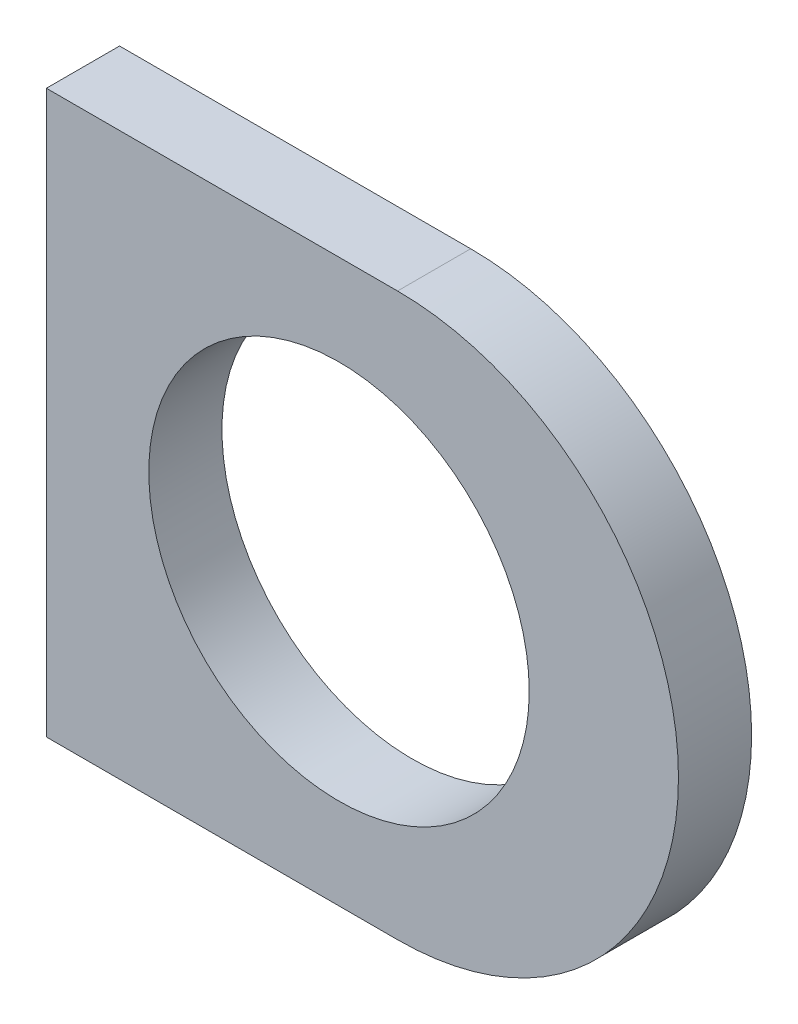
ISO-10303-21;
HEADER;
FILE_DESCRIPTION(('STEP AP214'),'2;1');
FILE_NAME('part.step','',(''),(''),'','','');
FILE_SCHEMA(('AUTOMOTIVE_DESIGN { 1 0 10303 214 1 1 1 1 }'));
ENDSEC;
DATA;
#1=APPLICATION_CONTEXT('core data for automotive mechanical design processes');
#2=APPLICATION_PROTOCOL_DEFINITION('international standard','automotive_design',2000,#1);
#3=PRODUCT_CONTEXT('',#1,'mechanical');
#4=PRODUCT('Part','Part','',(#3));
#5=PRODUCT_RELATED_PRODUCT_CATEGORY('part','',(#4));
#6=PRODUCT_DEFINITION_FORMATION('','',#4);
#7=PRODUCT_DEFINITION_CONTEXT('part definition',#1,'design');
#8=PRODUCT_DEFINITION('design','',#6,#7);
#9=PRODUCT_DEFINITION_SHAPE('','',#8);
#10=(LENGTH_UNIT() NAMED_UNIT(*) SI_UNIT(.MILLI.,.METRE.));
#11=(NAMED_UNIT(*) PLANE_ANGLE_UNIT() SI_UNIT($,.RADIAN.));
#12=(NAMED_UNIT(*) SI_UNIT($,.STERADIAN.) SOLID_ANGLE_UNIT());
#13=UNCERTAINTY_MEASURE_WITH_UNIT(LENGTH_MEASURE(1.E-05),#10,'distance_accuracy_value','');
#14=(GEOMETRIC_REPRESENTATION_CONTEXT(3) GLOBAL_UNCERTAINTY_ASSIGNED_CONTEXT((#13)) GLOBAL_UNIT_ASSIGNED_CONTEXT((#10,
#11,#12)) REPRESENTATION_CONTEXT('',''));
#15=CARTESIAN_POINT('',(0.,0.,0.));
#16=DIRECTION('',(0.,0.,1.));
#17=DIRECTION('',(1.,0.,0.));
#18=AXIS2_PLACEMENT_3D('',#15,#16,#17);
#19=CARTESIAN_POINT('',(0.,0.,12.5));
#20=DIRECTION('',(0.,0.,-1.));
#21=DIRECTION('',(-1.,0.,0.));
#22=AXIS2_PLACEMENT_3D('',#19,#20,#21);
#23=CYLINDRICAL_SURFACE('',#22,48.);
#24=CARTESIAN_POINT('',(0.,0.,0.));
#25=DIRECTION('',(0.,0.,1.));
#26=DIRECTION('',(1.,0.,0.));
#27=AXIS2_PLACEMENT_3D('',#24,#25,#26);
#28=CIRCLE('',#27,48.);
#29=CARTESIAN_POINT('',(0.,-48.,0.));
#30=VERTEX_POINT('',#29);
#31=CARTESIAN_POINT('',(0.,48.,0.));
#32=VERTEX_POINT('',#31);
#33=EDGE_CURVE('E101',#30,#32,#28,.T.);
#34=ORIENTED_EDGE('',*,*,#33,.T.);
#35=DIRECTION('',(0.,0.,-1.));
#36=VECTOR('',#35,1.);
#37=CARTESIAN_POINT('',(0.,48.,12.5));
#38=LINE('',#37,#36);
#39=CARTESIAN_POINT('',(0.,48.,12.5));
#40=VERTEX_POINT('',#39);
#41=EDGE_CURVE('E11',#40,#32,#38,.T.);
#42=ORIENTED_EDGE('',*,*,#41,.F.);
#43=CARTESIAN_POINT('',(0.,0.,12.5));
#44=DIRECTION('',(0.,0.,1.));
#45=DIRECTION('',(1.,0.,0.));
#46=AXIS2_PLACEMENT_3D('',#43,#44,#45);
#47=CIRCLE('',#46,48.);
#48=CARTESIAN_POINT('',(0.,-48.,12.5));
#49=VERTEX_POINT('',#48);
#50=EDGE_CURVE('E88',#49,#40,#47,.T.);
#51=ORIENTED_EDGE('',*,*,#50,.F.);
#52=DIRECTION('',(0.,0.,-1.));
#53=VECTOR('',#52,1.);
#54=CARTESIAN_POINT('',(0.,-48.,12.5));
#55=LINE('',#54,#53);
#56=EDGE_CURVE('E97',#49,#30,#55,.T.);
#57=ORIENTED_EDGE('',*,*,#56,.T.);
#58=EDGE_LOOP('',(#34,#42,#51,#57));
#59=FACE_BOUND('',#58,.T.);
#60=ADVANCED_FACE('F36',(#59),#23,.T.);
#61=CARTESIAN_POINT('',(-60.,48.,12.5));
#62=DIRECTION('',(0.,-1.,0.));
#63=DIRECTION('',(0.,0.,-1.));
#64=AXIS2_PLACEMENT_3D('',#61,#62,#63);
#65=PLANE('',#64);
#66=DIRECTION('',(-1.,0.,0.));
#67=VECTOR('',#66,1.);
#68=CARTESIAN_POINT('',(-60.,48.,0.));
#69=LINE('',#68,#67);
#70=CARTESIAN_POINT('',(-60.,48.,0.));
#71=VERTEX_POINT('',#70);
#72=EDGE_CURVE('E92',#32,#71,#69,.T.);
#73=ORIENTED_EDGE('',*,*,#72,.T.);
#74=DIRECTION('',(0.,0.,-1.));
#75=VECTOR('',#74,1.);
#76=CARTESIAN_POINT('',(-60.,48.,12.5));
#77=LINE('',#76,#75);
#78=CARTESIAN_POINT('',(-60.,48.,12.5));
#79=VERTEX_POINT('',#78);
#80=EDGE_CURVE('E45',#79,#71,#77,.T.);
#81=ORIENTED_EDGE('',*,*,#80,.F.);
#82=DIRECTION('',(-1.,0.,0.));
#83=VECTOR('',#82,1.);
#84=CARTESIAN_POINT('',(-60.,48.,12.5));
#85=LINE('',#84,#83);
#86=EDGE_CURVE('E83',#40,#79,#85,.T.);
#87=ORIENTED_EDGE('',*,*,#86,.F.);
#88=ORIENTED_EDGE('',*,*,#41,.T.);
#89=EDGE_LOOP('',(#73,#81,#87,#88));
#90=FACE_BOUND('',#89,.T.);
#91=ADVANCED_FACE('F91',(#90),#65,.F.);
#92=CARTESIAN_POINT('',(-60.,48.,12.5));
#93=DIRECTION('',(1.,0.,0.));
#94=DIRECTION('',(0.,1.,0.));
#95=AXIS2_PLACEMENT_3D('',#92,#93,#94);
#96=PLANE('',#95);
#97=DIRECTION('',(0.,-1.,0.));
#98=VECTOR('',#97,1.);
#99=CARTESIAN_POINT('',(-60.,48.,0.));
#100=LINE('',#99,#98);
#101=CARTESIAN_POINT('',(-60.,-48.,0.));
#102=VERTEX_POINT('',#101);
#103=EDGE_CURVE('E70',#71,#102,#100,.T.);
#104=ORIENTED_EDGE('',*,*,#103,.T.);
#105=DIRECTION('',(0.,0.,-1.));
#106=VECTOR('',#105,1.);
#107=CARTESIAN_POINT('',(-60.,-48.,12.5));
#108=LINE('',#107,#106);
#109=CARTESIAN_POINT('',(-60.,-48.,12.5));
#110=VERTEX_POINT('',#109);
#111=EDGE_CURVE('E93',#110,#102,#108,.T.);
#112=ORIENTED_EDGE('',*,*,#111,.F.);
#113=DIRECTION('',(0.,-1.,0.));
#114=VECTOR('',#113,1.);
#115=CARTESIAN_POINT('',(-60.,48.,12.5));
#116=LINE('',#115,#114);
#117=EDGE_CURVE('E86',#79,#110,#116,.T.);
#118=ORIENTED_EDGE('',*,*,#117,.F.);
#119=ORIENTED_EDGE('',*,*,#80,.T.);
#120=EDGE_LOOP('',(#104,#112,#118,#119));
#121=FACE_BOUND('',#120,.T.);
#122=ADVANCED_FACE('F95',(#121),#96,.F.);
#123=CARTESIAN_POINT('',(-60.,-48.,12.5));
#124=DIRECTION('',(0.,1.,0.));
#125=DIRECTION('',(0.,0.,1.));
#126=AXIS2_PLACEMENT_3D('',#123,#124,#125);
#127=PLANE('',#126);
#128=DIRECTION('',(1.,0.,0.));
#129=VECTOR('',#128,1.);
#130=CARTESIAN_POINT('',(-60.,-48.,0.));
#131=LINE('',#130,#129);
#132=EDGE_CURVE('E76',#102,#30,#131,.T.);
#133=ORIENTED_EDGE('',*,*,#132,.T.);
#134=ORIENTED_EDGE('',*,*,#56,.F.);
#135=DIRECTION('',(1.,0.,0.));
#136=VECTOR('',#135,1.);
#137=CARTESIAN_POINT('',(-60.,-48.,12.5));
#138=LINE('',#137,#136);
#139=EDGE_CURVE('E53',#110,#49,#138,.T.);
#140=ORIENTED_EDGE('',*,*,#139,.F.);
#141=ORIENTED_EDGE('',*,*,#111,.T.);
#142=EDGE_LOOP('',(#133,#134,#140,#141));
#143=FACE_BOUND('',#142,.T.);
#144=ADVANCED_FACE('F108',(#143),#127,.F.);
#145=CARTESIAN_POINT('',(0.,0.,12.5));
#146=DIRECTION('',(0.,0.,1.));
#147=DIRECTION('',(1.,0.,0.));
#148=AXIS2_PLACEMENT_3D('',#145,#146,#147);
#149=PLANE('',#148);
#150=CARTESIAN_POINT('',(-9.99999999999999,0.,12.5));
#151=DIRECTION('',(0.,0.,1.));
#152=DIRECTION('',(1.,0.,0.));
#153=AXIS2_PLACEMENT_3D('',#150,#151,#152);
#154=CIRCLE('',#153,32.5);
#155=CARTESIAN_POINT('',(22.5,0.,12.5));
#156=VERTEX_POINT('',#155);
#157=EDGE_CURVE('E114',#156,#156,#154,.T.);
#158=ORIENTED_EDGE('',*,*,#157,.F.);
#159=EDGE_LOOP('',(#158));
#160=FACE_BOUND('',#159,.T.);
#161=ORIENTED_EDGE('',*,*,#50,.T.);
#162=ORIENTED_EDGE('',*,*,#86,.T.);
#163=ORIENTED_EDGE('',*,*,#117,.T.);
#164=ORIENTED_EDGE('',*,*,#139,.T.);
#165=EDGE_LOOP('',(#161,#162,#163,#164));
#166=FACE_BOUND('',#165,.T.);
#167=ADVANCED_FACE('F84',(#160,#166),#149,.T.);
#168=CARTESIAN_POINT('',(0.,0.,0.));
#169=DIRECTION('',(0.,0.,1.));
#170=DIRECTION('',(1.,0.,0.));
#171=AXIS2_PLACEMENT_3D('',#168,#169,#170);
#172=PLANE('',#171);
#173=CARTESIAN_POINT('',(-9.99999999999999,0.,0.));
#174=DIRECTION('',(0.,0.,1.));
#175=DIRECTION('',(1.,0.,0.));
#176=AXIS2_PLACEMENT_3D('',#173,#174,#175);
#177=CIRCLE('',#176,32.5);
#178=CARTESIAN_POINT('',(22.5,0.,0.));
#179=VERTEX_POINT('',#178);
#180=EDGE_CURVE('E39',#179,#179,#177,.T.);
#181=ORIENTED_EDGE('',*,*,#180,.T.);
#182=EDGE_LOOP('',(#181));
#183=FACE_BOUND('',#182,.T.);
#184=ORIENTED_EDGE('',*,*,#33,.F.);
#185=ORIENTED_EDGE('',*,*,#132,.F.);
#186=ORIENTED_EDGE('',*,*,#103,.F.);
#187=ORIENTED_EDGE('',*,*,#72,.F.);
#188=EDGE_LOOP('',(#184,#185,#186,#187));
#189=FACE_BOUND('',#188,.T.);
#190=ADVANCED_FACE('F111',(#183,#189),#172,.F.);
#191=CARTESIAN_POINT('',(-9.99999999999999,0.,-1.2E-05));
#192=DIRECTION('',(0.,0.,1.));
#193=DIRECTION('',(1.,0.,0.));
#194=AXIS2_PLACEMENT_3D('',#191,#192,#193);
#195=CYLINDRICAL_SURFACE('',#194,32.5);
#196=CARTESIAN_POINT('',(22.5,0.,12.5));
#197=CARTESIAN_POINT('',(22.5,0.,12.3697916666667));
#198=CARTESIAN_POINT('',(22.5,0.,12.2395833333333));
#199=CARTESIAN_POINT('',(22.5,0.,11.9791666666667));
#200=CARTESIAN_POINT('',(22.5,0.,11.8489583333333));
#201=CARTESIAN_POINT('',(22.5,0.,11.5885416666667));
#202=CARTESIAN_POINT('',(22.5,0.,11.4583333333333));
#203=CARTESIAN_POINT('',(22.5,0.,11.1979166666667));
#204=CARTESIAN_POINT('',(22.5,0.,11.0677083333333));
#205=CARTESIAN_POINT('',(22.5,0.,10.8072916666667));
#206=CARTESIAN_POINT('',(22.5,0.,10.6770833333333));
#207=CARTESIAN_POINT('',(22.5,0.,10.4166666666667));
#208=CARTESIAN_POINT('',(22.5,0.,10.2864583333333));
#209=CARTESIAN_POINT('',(22.5,0.,10.0260416666667));
#210=CARTESIAN_POINT('',(22.5,0.,9.89583333333333));
#211=CARTESIAN_POINT('',(22.5,0.,9.63541666666667));
#212=CARTESIAN_POINT('',(22.5,0.,9.50520833333333));
#213=CARTESIAN_POINT('',(22.5,0.,9.24479166666667));
#214=CARTESIAN_POINT('',(22.5,0.,9.11458333333333));
#215=CARTESIAN_POINT('',(22.5,0.,8.85416666666667));
#216=CARTESIAN_POINT('',(22.5,0.,8.72395833333333));
#217=CARTESIAN_POINT('',(22.5,0.,8.46354166666667));
#218=CARTESIAN_POINT('',(22.5,0.,8.33333333333333));
#219=CARTESIAN_POINT('',(22.5,0.,8.07291666666667));
#220=CARTESIAN_POINT('',(22.5,0.,7.94270833333333));
#221=CARTESIAN_POINT('',(22.5,0.,7.68229166666667));
#222=CARTESIAN_POINT('',(22.5,0.,7.55208333333333));
#223=CARTESIAN_POINT('',(22.5,0.,7.29166666666667));
#224=CARTESIAN_POINT('',(22.5,0.,7.16145833333333));
#225=CARTESIAN_POINT('',(22.5,0.,6.90104166666667));
#226=CARTESIAN_POINT('',(22.5,0.,6.77083333333333));
#227=CARTESIAN_POINT('',(22.5,0.,6.51041666666667));
#228=CARTESIAN_POINT('',(22.5,0.,6.38020833333333));
#229=CARTESIAN_POINT('',(22.5,0.,6.11979166666667));
#230=CARTESIAN_POINT('',(22.5,0.,5.98958333333333));
#231=CARTESIAN_POINT('',(22.5,0.,5.72916666666667));
#232=CARTESIAN_POINT('',(22.5,0.,5.59895833333333));
#233=CARTESIAN_POINT('',(22.5,0.,5.33854166666667));
#234=CARTESIAN_POINT('',(22.5,0.,5.20833333333333));
#235=CARTESIAN_POINT('',(22.5,0.,4.94791666666667));
#236=CARTESIAN_POINT('',(22.5,0.,4.81770833333333));
#237=CARTESIAN_POINT('',(22.5,0.,4.55729166666667));
#238=CARTESIAN_POINT('',(22.5,0.,4.42708333333333));
#239=CARTESIAN_POINT('',(22.5,0.,4.16666666666667));
#240=CARTESIAN_POINT('',(22.5,0.,4.03645833333333));
#241=CARTESIAN_POINT('',(22.5,0.,3.77604166666667));
#242=CARTESIAN_POINT('',(22.5,0.,3.64583333333333));
#243=CARTESIAN_POINT('',(22.5,0.,3.38541666666667));
#244=CARTESIAN_POINT('',(22.5,0.,3.25520833333333));
#245=CARTESIAN_POINT('',(22.5,0.,2.99479166666667));
#246=CARTESIAN_POINT('',(22.5,0.,2.86458333333333));
#247=CARTESIAN_POINT('',(22.5,0.,2.60416666666667));
#248=CARTESIAN_POINT('',(22.5,0.,2.47395833333333));
#249=CARTESIAN_POINT('',(22.5,0.,2.21354166666667));
#250=CARTESIAN_POINT('',(22.5,0.,2.08333333333333));
#251=CARTESIAN_POINT('',(22.5,0.,1.82291666666667));
#252=CARTESIAN_POINT('',(22.5,0.,1.69270833333333));
#253=CARTESIAN_POINT('',(22.5,0.,1.43229166666667));
#254=CARTESIAN_POINT('',(22.5,0.,1.30208333333333));
#255=CARTESIAN_POINT('',(22.5,0.,1.04166666666667));
#256=CARTESIAN_POINT('',(22.5,0.,0.911458333333334));
#257=CARTESIAN_POINT('',(22.5,0.,0.651041666666668));
#258=CARTESIAN_POINT('',(22.5,0.,0.520833333333334));
#259=CARTESIAN_POINT('',(22.5,0.,0.260416666666667));
#260=CARTESIAN_POINT('',(22.5,0.,0.130208333333334));
#261=CARTESIAN_POINT('',(22.5,0.,0.));
#262=B_SPLINE_CURVE_WITH_KNOTS('',3,(#196,#197,#198,#199,#200,#201,#202,#203,#204,#205,#206,
#207,#208,#209,#210,#211,#212,#213,#214,#215,#216,#217,#218,#219,#220,#221,#222,#223,#224,#225,
#226,#227,#228,#229,#230,#231,#232,#233,#234,#235,#236,#237,#238,#239,#240,#241,#242,#243,#244,
#245,#246,#247,#248,#249,#250,#251,#252,#253,#254,#255,#256,#257,#258,#259,#260,#261),
.UNSPECIFIED.,.F.,.F.,(4,2,2,2,2,2,2,2,2,2,2,2,2,2,2,2,2,2,2,2,2,2,2,2,2,2,2,2,2,2,2,2,4),(0.,
0.390625,0.781250000000001,1.171875,1.5625,1.953125,2.34375,2.734375,3.125,3.515625,3.90625,
4.296875,4.6875,5.078125,5.46875,5.859375,6.25,6.640625,7.03125,7.421875,7.8125,8.203125,
8.59375,8.984375,9.375,9.765625,10.15625,10.546875,10.9375,11.328125,11.71875,12.109375,12.5),.UNSPECIFIED.);
#263=EDGE_CURVE('BSEAM122',#156,#179,#262,.T.);
#264=ORIENTED_EDGE('',*,*,#157,.T.);
#265=ORIENTED_EDGE('',*,*,#180,.F.);
#266=ORIENTED_EDGE('',*,*,#263,.T.);
#267=ORIENTED_EDGE('',*,*,#263,.F.);
#268=EDGE_LOOP('',(#264,#266,#265,#267));
#269=FACE_BOUND('',#268,.T.);
#270=ADVANCED_FACE('F122',(#269),#195,.F.);
#271=CLOSED_SHELL('',(#60,#91,#122,#144,#167,#190,#270));
#272=MANIFOLD_SOLID_BREP('B2',#271);
#273=ADVANCED_BREP_SHAPE_REPRESENTATION('',(#18,#272),#14);
#274=SHAPE_DEFINITION_REPRESENTATION(#9,#273);
ENDSEC;
END-ISO-10303-21;
